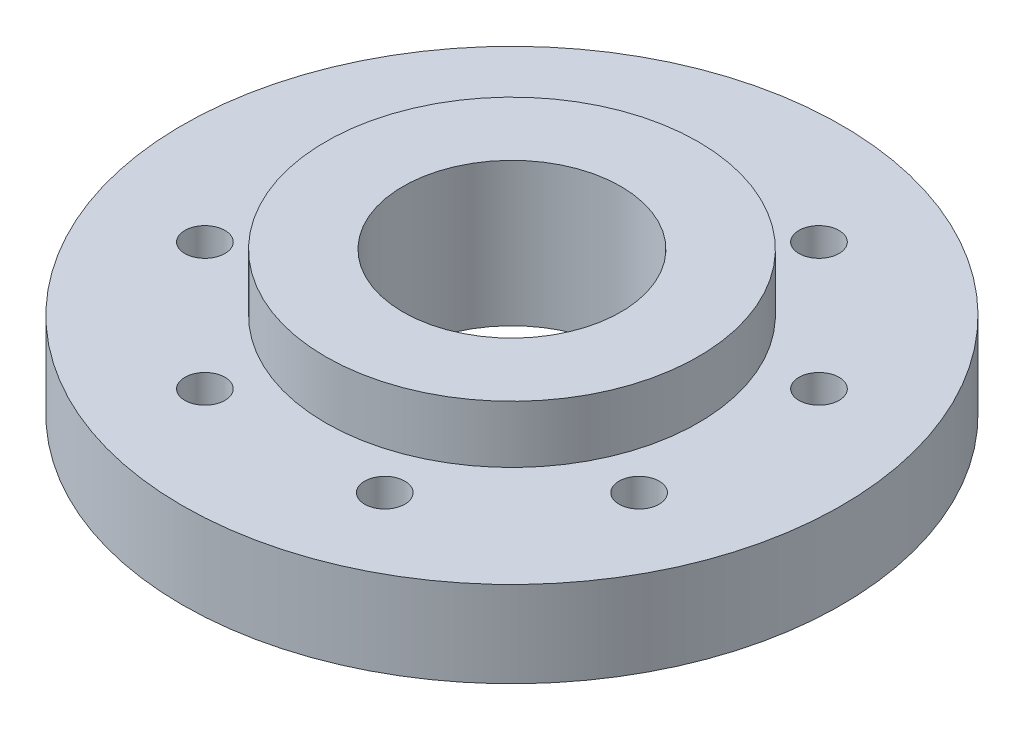
ISO-10303-21;
HEADER;
FILE_DESCRIPTION(('STEP AP214'),'2;1');
FILE_NAME('part.step','',(''),(''),'','','');
FILE_SCHEMA(('AUTOMOTIVE_DESIGN { 1 0 10303 214 1 1 1 1 }'));
ENDSEC;
DATA;
#1=APPLICATION_CONTEXT('core data for automotive mechanical design processes');
#2=APPLICATION_PROTOCOL_DEFINITION('international standard','automotive_design',2000,#1);
#3=PRODUCT_CONTEXT('',#1,'mechanical');
#4=PRODUCT('Part','Part','',(#3));
#5=PRODUCT_RELATED_PRODUCT_CATEGORY('part','',(#4));
#6=PRODUCT_DEFINITION_FORMATION('','',#4);
#7=PRODUCT_DEFINITION_CONTEXT('part definition',#1,'design');
#8=PRODUCT_DEFINITION('design','',#6,#7);
#9=PRODUCT_DEFINITION_SHAPE('','',#8);
#10=(LENGTH_UNIT() NAMED_UNIT(*) SI_UNIT(.MILLI.,.METRE.));
#11=(NAMED_UNIT(*) PLANE_ANGLE_UNIT() SI_UNIT($,.RADIAN.));
#12=(NAMED_UNIT(*) SI_UNIT($,.STERADIAN.) SOLID_ANGLE_UNIT());
#13=UNCERTAINTY_MEASURE_WITH_UNIT(LENGTH_MEASURE(1.E-05),#10,'distance_accuracy_value','');
#14=(GEOMETRIC_REPRESENTATION_CONTEXT(3) GLOBAL_UNCERTAINTY_ASSIGNED_CONTEXT((#13)) GLOBAL_UNIT_ASSIGNED_CONTEXT((#10,
#11,#12)) REPRESENTATION_CONTEXT('',''));
#15=CARTESIAN_POINT('',(0.,0.,0.));
#16=DIRECTION('',(0.,0.,1.));
#17=DIRECTION('',(1.,0.,0.));
#18=AXIS2_PLACEMENT_3D('',#15,#16,#17);
#19=CARTESIAN_POINT('',(0.,30.,0.));
#20=DIRECTION('',(0.,1.,0.));
#21=DIRECTION('',(0.,0.,1.));
#22=AXIS2_PLACEMENT_3D('',#19,#20,#21);
#23=PLANE('',#22);
#24=CARTESIAN_POINT('',(75.7581216659255,30.,31.3800414539374));
#25=DIRECTION('',(0.,1.,0.));
#26=DIRECTION('',(0.,0.,1.));
#27=AXIS2_PLACEMENT_3D('',#24,#25,#26);
#28=CIRCLE('',#27,7.);
#29=CARTESIAN_POINT('',(75.7581216659255,30.,38.3800414539374));
#30=VERTEX_POINT('',#29);
#31=EDGE_CURVE('E92',#30,#30,#28,.T.);
#32=ORIENTED_EDGE('',*,*,#31,.F.);
#33=EDGE_LOOP('',(#32));
#34=FACE_BOUND('',#33,.T.);
#35=CARTESIAN_POINT('',(-31.3800414539374,30.,75.7581216659255));
#36=DIRECTION('',(0.,1.,0.));
#37=DIRECTION('',(0.,0.,1.));
#38=AXIS2_PLACEMENT_3D('',#35,#36,#37);
#39=CIRCLE('',#38,7.00000000000002);
#40=CARTESIAN_POINT('',(-31.3800414539374,30.,82.7581216659255));
#41=VERTEX_POINT('',#40);
#42=EDGE_CURVE('E80',#41,#41,#39,.T.);
#43=ORIENTED_EDGE('',*,*,#42,.F.);
#44=EDGE_LOOP('',(#43));
#45=FACE_BOUND('',#44,.T.);
#46=CARTESIAN_POINT('',(-75.7581216659255,30.,-31.3800414539374));
#47=DIRECTION('',(0.,1.,0.));
#48=DIRECTION('',(0.,0.,1.));
#49=AXIS2_PLACEMENT_3D('',#46,#47,#48);
#50=CIRCLE('',#49,7.);
#51=CARTESIAN_POINT('',(-75.7581216659255,30.,-24.3800414539374));
#52=VERTEX_POINT('',#51);
#53=EDGE_CURVE('E68',#52,#52,#50,.T.);
#54=ORIENTED_EDGE('',*,*,#53,.F.);
#55=EDGE_LOOP('',(#54));
#56=FACE_BOUND('',#55,.T.);
#57=CARTESIAN_POINT('',(31.3800414539374,30.,-75.7581216659255));
#58=DIRECTION('',(0.,1.,0.));
#59=DIRECTION('',(0.,0.,1.));
#60=AXIS2_PLACEMENT_3D('',#57,#58,#59);
#61=CIRCLE('',#60,7.);
#62=CARTESIAN_POINT('',(31.3800414539374,30.,-68.7581216659255));
#63=VERTEX_POINT('',#62);
#64=EDGE_CURVE('E56',#63,#63,#61,.T.);
#65=ORIENTED_EDGE('',*,*,#64,.F.);
#66=EDGE_LOOP('',(#65));
#67=FACE_BOUND('',#66,.T.);
#68=CARTESIAN_POINT('',(0.,30.,0.));
#69=DIRECTION('',(0.,1.,0.));
#70=DIRECTION('',(0.,0.,1.));
#71=AXIS2_PLACEMENT_3D('',#68,#69,#70);
#72=CIRCLE('',#71,115.);
#73=CARTESIAN_POINT('',(0.,30.,115.));
#74=VERTEX_POINT('',#73);
#75=EDGE_CURVE('E10',#74,#74,#72,.T.);
#76=ORIENTED_EDGE('',*,*,#75,.T.);
#77=EDGE_LOOP('',(#76));
#78=FACE_BOUND('',#77,.T.);
#79=CARTESIAN_POINT('',(75.7581216659255,30.,-31.3800414539374));
#80=DIRECTION('',(0.,1.,0.));
#81=DIRECTION('',(0.,0.,1.));
#82=AXIS2_PLACEMENT_3D('',#79,#80,#81);
#83=CIRCLE('',#82,7.);
#84=CARTESIAN_POINT('',(75.7581216659255,30.,-24.3800414539374));
#85=VERTEX_POINT('',#84);
#86=EDGE_CURVE('E52',#85,#85,#83,.T.);
#87=ORIENTED_EDGE('',*,*,#86,.F.);
#88=EDGE_LOOP('',(#87));
#89=FACE_BOUND('',#88,.T.);
#90=CARTESIAN_POINT('',(-31.3800414539374,30.,-75.7581216659255));
#91=DIRECTION('',(0.,1.,0.));
#92=DIRECTION('',(0.,0.,1.));
#93=AXIS2_PLACEMENT_3D('',#90,#91,#92);
#94=CIRCLE('',#93,7.);
#95=CARTESIAN_POINT('',(-31.3800414539374,30.,-68.7581216659255));
#96=VERTEX_POINT('',#95);
#97=EDGE_CURVE('E62',#96,#96,#94,.T.);
#98=ORIENTED_EDGE('',*,*,#97,.F.);
#99=EDGE_LOOP('',(#98));
#100=FACE_BOUND('',#99,.T.);
#101=CARTESIAN_POINT('',(-75.7581216659255,30.,31.3800414539374));
#102=DIRECTION('',(0.,1.,0.));
#103=DIRECTION('',(0.,0.,1.));
#104=AXIS2_PLACEMENT_3D('',#101,#102,#103);
#105=CIRCLE('',#104,7.);
#106=CARTESIAN_POINT('',(-75.7581216659255,30.,38.3800414539374));
#107=VERTEX_POINT('',#106);
#108=EDGE_CURVE('E74',#107,#107,#105,.T.);
#109=ORIENTED_EDGE('',*,*,#108,.F.);
#110=EDGE_LOOP('',(#109));
#111=FACE_BOUND('',#110,.T.);
#112=CARTESIAN_POINT('',(31.3800414539374,30.,75.7581216659255));
#113=DIRECTION('',(0.,1.,0.));
#114=DIRECTION('',(0.,0.,1.));
#115=AXIS2_PLACEMENT_3D('',#112,#113,#114);
#116=CIRCLE('',#115,7.00000000000002);
#117=CARTESIAN_POINT('',(31.3800414539374,30.,82.7581216659255));
#118=VERTEX_POINT('',#117);
#119=EDGE_CURVE('E86',#118,#118,#116,.T.);
#120=ORIENTED_EDGE('',*,*,#119,.F.);
#121=EDGE_LOOP('',(#120));
#122=FACE_BOUND('',#121,.T.);
#123=CARTESIAN_POINT('',(0.,30.,0.));
#124=DIRECTION('',(0.,1.,0.));
#125=DIRECTION('',(0.,0.,1.));
#126=AXIS2_PLACEMENT_3D('',#123,#124,#125);
#127=CIRCLE('',#126,65.);
#128=CARTESIAN_POINT('',(0.,30.,65.));
#129=VERTEX_POINT('',#128);
#130=EDGE_CURVE('E98',#129,#129,#127,.F.);
#131=ORIENTED_EDGE('',*,*,#130,.T.);
#132=EDGE_LOOP('',(#131));
#133=FACE_BOUND('',#132,.T.);
#134=ADVANCED_FACE('F37',(#34,#45,#56,#67,#78,#89,#100,#111,#122,#133),#23,.T.);
#135=CARTESIAN_POINT('',(0.,0.,0.));
#136=DIRECTION('',(0.,1.,0.));
#137=DIRECTION('',(0.,0.,1.));
#138=AXIS2_PLACEMENT_3D('',#135,#136,#137);
#139=PLANE('',#138);
#140=CARTESIAN_POINT('',(0.,0.,0.));
#141=DIRECTION('',(0.,1.,0.));
#142=DIRECTION('',(0.,0.,1.));
#143=AXIS2_PLACEMENT_3D('',#140,#141,#142);
#144=CIRCLE('',#143,38.);
#145=CARTESIAN_POINT('',(0.,0.,38.));
#146=VERTEX_POINT('',#145);
#147=EDGE_CURVE('E48',#146,#146,#144,.T.);
#148=ORIENTED_EDGE('',*,*,#147,.T.);
#149=EDGE_LOOP('',(#148));
#150=FACE_BOUND('',#149,.T.);
#151=CARTESIAN_POINT('',(75.7581216659255,0.,31.3800414539374));
#152=DIRECTION('',(0.,1.,0.));
#153=DIRECTION('',(0.,0.,1.));
#154=AXIS2_PLACEMENT_3D('',#151,#152,#153);
#155=CIRCLE('',#154,7.);
#156=CARTESIAN_POINT('',(75.7581216659255,0.,38.3800414539374));
#157=VERTEX_POINT('',#156);
#158=EDGE_CURVE('E95',#157,#157,#155,.T.);
#159=ORIENTED_EDGE('',*,*,#158,.T.);
#160=EDGE_LOOP('',(#159));
#161=FACE_BOUND('',#160,.T.);
#162=CARTESIAN_POINT('',(31.3800414539374,0.,75.7581216659255));
#163=DIRECTION('',(0.,1.,0.));
#164=DIRECTION('',(0.,0.,1.));
#165=AXIS2_PLACEMENT_3D('',#162,#163,#164);
#166=CIRCLE('',#165,7.00000000000002);
#167=CARTESIAN_POINT('',(31.3800414539374,0.,82.7581216659255));
#168=VERTEX_POINT('',#167);
#169=EDGE_CURVE('E89',#168,#168,#166,.T.);
#170=ORIENTED_EDGE('',*,*,#169,.T.);
#171=EDGE_LOOP('',(#170));
#172=FACE_BOUND('',#171,.T.);
#173=CARTESIAN_POINT('',(-31.3800414539374,0.,75.7581216659255));
#174=DIRECTION('',(0.,1.,0.));
#175=DIRECTION('',(0.,0.,1.));
#176=AXIS2_PLACEMENT_3D('',#173,#174,#175);
#177=CIRCLE('',#176,7.00000000000002);
#178=CARTESIAN_POINT('',(-31.3800414539374,0.,82.7581216659255));
#179=VERTEX_POINT('',#178);
#180=EDGE_CURVE('E83',#179,#179,#177,.T.);
#181=ORIENTED_EDGE('',*,*,#180,.T.);
#182=EDGE_LOOP('',(#181));
#183=FACE_BOUND('',#182,.T.);
#184=CARTESIAN_POINT('',(-75.7581216659255,0.,31.3800414539374));
#185=DIRECTION('',(0.,1.,0.));
#186=DIRECTION('',(0.,0.,1.));
#187=AXIS2_PLACEMENT_3D('',#184,#185,#186);
#188=CIRCLE('',#187,7.);
#189=CARTESIAN_POINT('',(-75.7581216659255,0.,38.3800414539374));
#190=VERTEX_POINT('',#189);
#191=EDGE_CURVE('E77',#190,#190,#188,.T.);
#192=ORIENTED_EDGE('',*,*,#191,.T.);
#193=EDGE_LOOP('',(#192));
#194=FACE_BOUND('',#193,.T.);
#195=CARTESIAN_POINT('',(-75.7581216659255,0.,-31.3800414539374));
#196=DIRECTION('',(0.,1.,0.));
#197=DIRECTION('',(0.,0.,1.));
#198=AXIS2_PLACEMENT_3D('',#195,#196,#197);
#199=CIRCLE('',#198,7.);
#200=CARTESIAN_POINT('',(-75.7581216659255,0.,-24.3800414539374));
#201=VERTEX_POINT('',#200);
#202=EDGE_CURVE('E71',#201,#201,#199,.T.);
#203=ORIENTED_EDGE('',*,*,#202,.T.);
#204=EDGE_LOOP('',(#203));
#205=FACE_BOUND('',#204,.T.);
#206=CARTESIAN_POINT('',(-31.3800414539374,0.,-75.7581216659255));
#207=DIRECTION('',(0.,1.,0.));
#208=DIRECTION('',(0.,0.,1.));
#209=AXIS2_PLACEMENT_3D('',#206,#207,#208);
#210=CIRCLE('',#209,7.);
#211=CARTESIAN_POINT('',(-31.3800414539374,0.,-68.7581216659255));
#212=VERTEX_POINT('',#211);
#213=EDGE_CURVE('E65',#212,#212,#210,.T.);
#214=ORIENTED_EDGE('',*,*,#213,.T.);
#215=EDGE_LOOP('',(#214));
#216=FACE_BOUND('',#215,.T.);
#217=CARTESIAN_POINT('',(31.3800414539374,0.,-75.7581216659255));
#218=DIRECTION('',(0.,1.,0.));
#219=DIRECTION('',(0.,0.,1.));
#220=AXIS2_PLACEMENT_3D('',#217,#218,#219);
#221=CIRCLE('',#220,7.);
#222=CARTESIAN_POINT('',(31.3800414539374,0.,-68.7581216659255));
#223=VERTEX_POINT('',#222);
#224=EDGE_CURVE('E59',#223,#223,#221,.T.);
#225=ORIENTED_EDGE('',*,*,#224,.T.);
#226=EDGE_LOOP('',(#225));
#227=FACE_BOUND('',#226,.T.);
#228=CARTESIAN_POINT('',(75.7581216659255,0.,-31.3800414539374));
#229=DIRECTION('',(0.,1.,0.));
#230=DIRECTION('',(0.,0.,1.));
#231=AXIS2_PLACEMENT_3D('',#228,#229,#230);
#232=CIRCLE('',#231,7.);
#233=CARTESIAN_POINT('',(75.7581216659255,0.,-24.3800414539374));
#234=VERTEX_POINT('',#233);
#235=EDGE_CURVE('E53',#234,#234,#232,.T.);
#236=ORIENTED_EDGE('',*,*,#235,.T.);
#237=EDGE_LOOP('',(#236));
#238=FACE_BOUND('',#237,.T.);
#239=CARTESIAN_POINT('',(0.,0.,0.));
#240=DIRECTION('',(0.,1.,0.));
#241=DIRECTION('',(0.,0.,1.));
#242=AXIS2_PLACEMENT_3D('',#239,#240,#241);
#243=CIRCLE('',#242,115.);
#244=CARTESIAN_POINT('',(0.,0.,115.));
#245=VERTEX_POINT('',#244);
#246=EDGE_CURVE('E41',#245,#245,#243,.T.);
#247=ORIENTED_EDGE('',*,*,#246,.F.);
#248=EDGE_LOOP('',(#247));
#249=FACE_BOUND('',#248,.T.);
#250=ADVANCED_FACE('F128',(#150,#161,#172,#183,#194,#205,#216,#227,#238,#249),#139,.F.);
#251=CARTESIAN_POINT('',(0.,30.,0.));
#252=DIRECTION('',(0.,-1.,0.));
#253=DIRECTION('',(0.,0.,-1.));
#254=AXIS2_PLACEMENT_3D('',#251,#252,#253);
#255=CYLINDRICAL_SURFACE('',#254,115.);
#256=ORIENTED_EDGE('',*,*,#75,.F.);
#257=EDGE_LOOP('',(#256));
#258=FACE_BOUND('',#257,.T.);
#259=ORIENTED_EDGE('',*,*,#246,.T.);
#260=EDGE_LOOP('',(#259));
#261=FACE_BOUND('',#260,.T.);
#262=ADVANCED_FACE('F39',(#258,#261),#255,.T.);
#263=CARTESIAN_POINT('',(0.,30.,0.));
#264=DIRECTION('',(0.,-1.,0.));
#265=DIRECTION('',(0.,0.,-1.));
#266=AXIS2_PLACEMENT_3D('',#263,#264,#265);
#267=CYLINDRICAL_SURFACE('',#266,38.);
#268=ORIENTED_EDGE('',*,*,#147,.F.);
#269=EDGE_LOOP('',(#268));
#270=FACE_BOUND('',#269,.T.);
#271=CARTESIAN_POINT('',(0.,50.,0.));
#272=DIRECTION('',(0.,1.,0.));
#273=DIRECTION('',(0.,0.,1.));
#274=AXIS2_PLACEMENT_3D('',#271,#272,#273);
#275=CIRCLE('',#274,38.);
#276=CARTESIAN_POINT('',(0.,50.,38.));
#277=VERTEX_POINT('',#276);
#278=EDGE_CURVE('E106',#277,#277,#275,.T.);
#279=ORIENTED_EDGE('',*,*,#278,.T.);
#280=EDGE_LOOP('',(#279));
#281=FACE_BOUND('',#280,.T.);
#282=ADVANCED_FACE('F110',(#270,#281),#267,.F.);
#283=CARTESIAN_POINT('',(75.7581216659255,30.,-31.3800414539374));
#284=DIRECTION('',(0.,-1.,0.));
#285=DIRECTION('',(0.,0.,-1.));
#286=AXIS2_PLACEMENT_3D('',#283,#284,#285);
#287=CYLINDRICAL_SURFACE('',#286,7.);
#288=ORIENTED_EDGE('',*,*,#86,.T.);
#289=EDGE_LOOP('',(#288));
#290=FACE_BOUND('',#289,.T.);
#291=ORIENTED_EDGE('',*,*,#235,.F.);
#292=EDGE_LOOP('',(#291));
#293=FACE_BOUND('',#292,.T.);
#294=ADVANCED_FACE('F140',(#290,#293),#287,.F.);
#295=CARTESIAN_POINT('',(31.3800414539374,30.,-75.7581216659255));
#296=DIRECTION('',(0.,-1.,0.));
#297=DIRECTION('',(0.,0.,-1.));
#298=AXIS2_PLACEMENT_3D('',#295,#296,#297);
#299=CYLINDRICAL_SURFACE('',#298,7.);
#300=ORIENTED_EDGE('',*,*,#64,.T.);
#301=EDGE_LOOP('',(#300));
#302=FACE_BOUND('',#301,.T.);
#303=ORIENTED_EDGE('',*,*,#224,.F.);
#304=EDGE_LOOP('',(#303));
#305=FACE_BOUND('',#304,.T.);
#306=ADVANCED_FACE('F144',(#302,#305),#299,.F.);
#307=CARTESIAN_POINT('',(-31.3800414539374,30.,-75.7581216659255));
#308=DIRECTION('',(0.,-1.,0.));
#309=DIRECTION('',(0.,0.,-1.));
#310=AXIS2_PLACEMENT_3D('',#307,#308,#309);
#311=CYLINDRICAL_SURFACE('',#310,7.);
#312=ORIENTED_EDGE('',*,*,#97,.T.);
#313=EDGE_LOOP('',(#312));
#314=FACE_BOUND('',#313,.T.);
#315=ORIENTED_EDGE('',*,*,#213,.F.);
#316=EDGE_LOOP('',(#315));
#317=FACE_BOUND('',#316,.T.);
#318=ADVANCED_FACE('F148',(#314,#317),#311,.F.);
#319=CARTESIAN_POINT('',(-75.7581216659255,30.,-31.3800414539374));
#320=DIRECTION('',(0.,-1.,0.));
#321=DIRECTION('',(0.,0.,-1.));
#322=AXIS2_PLACEMENT_3D('',#319,#320,#321);
#323=CYLINDRICAL_SURFACE('',#322,7.);
#324=ORIENTED_EDGE('',*,*,#53,.T.);
#325=EDGE_LOOP('',(#324));
#326=FACE_BOUND('',#325,.T.);
#327=ORIENTED_EDGE('',*,*,#202,.F.);
#328=EDGE_LOOP('',(#327));
#329=FACE_BOUND('',#328,.T.);
#330=ADVANCED_FACE('F152',(#326,#329),#323,.F.);
#331=CARTESIAN_POINT('',(-75.7581216659255,30.,31.3800414539374));
#332=DIRECTION('',(0.,-1.,0.));
#333=DIRECTION('',(0.,0.,-1.));
#334=AXIS2_PLACEMENT_3D('',#331,#332,#333);
#335=CYLINDRICAL_SURFACE('',#334,7.);
#336=ORIENTED_EDGE('',*,*,#108,.T.);
#337=EDGE_LOOP('',(#336));
#338=FACE_BOUND('',#337,.T.);
#339=ORIENTED_EDGE('',*,*,#191,.F.);
#340=EDGE_LOOP('',(#339));
#341=FACE_BOUND('',#340,.T.);
#342=ADVANCED_FACE('F156',(#338,#341),#335,.F.);
#343=CARTESIAN_POINT('',(-31.3800414539374,30.,75.7581216659255));
#344=DIRECTION('',(0.,-1.,0.));
#345=DIRECTION('',(0.,0.,-1.));
#346=AXIS2_PLACEMENT_3D('',#343,#344,#345);
#347=CYLINDRICAL_SURFACE('',#346,7.00000000000002);
#348=ORIENTED_EDGE('',*,*,#42,.T.);
#349=EDGE_LOOP('',(#348));
#350=FACE_BOUND('',#349,.T.);
#351=ORIENTED_EDGE('',*,*,#180,.F.);
#352=EDGE_LOOP('',(#351));
#353=FACE_BOUND('',#352,.T.);
#354=ADVANCED_FACE('F160',(#350,#353),#347,.F.);
#355=CARTESIAN_POINT('',(31.3800414539374,30.,75.7581216659255));
#356=DIRECTION('',(0.,-1.,0.));
#357=DIRECTION('',(0.,0.,-1.));
#358=AXIS2_PLACEMENT_3D('',#355,#356,#357);
#359=CYLINDRICAL_SURFACE('',#358,7.00000000000002);
#360=ORIENTED_EDGE('',*,*,#119,.T.);
#361=EDGE_LOOP('',(#360));
#362=FACE_BOUND('',#361,.T.);
#363=ORIENTED_EDGE('',*,*,#169,.F.);
#364=EDGE_LOOP('',(#363));
#365=FACE_BOUND('',#364,.T.);
#366=ADVANCED_FACE('F124',(#362,#365),#359,.F.);
#367=CARTESIAN_POINT('',(75.7581216659255,30.,31.3800414539374));
#368=DIRECTION('',(0.,-1.,0.));
#369=DIRECTION('',(0.,0.,-1.));
#370=AXIS2_PLACEMENT_3D('',#367,#368,#369);
#371=CYLINDRICAL_SURFACE('',#370,7.);
#372=ORIENTED_EDGE('',*,*,#31,.T.);
#373=EDGE_LOOP('',(#372));
#374=FACE_BOUND('',#373,.T.);
#375=ORIENTED_EDGE('',*,*,#158,.F.);
#376=EDGE_LOOP('',(#375));
#377=FACE_BOUND('',#376,.T.);
#378=ADVANCED_FACE('F115',(#374,#377),#371,.F.);
#379=CARTESIAN_POINT('',(0.,50.,0.));
#380=DIRECTION('',(0.,1.,0.));
#381=DIRECTION('',(0.,0.,1.));
#382=AXIS2_PLACEMENT_3D('',#379,#380,#381);
#383=PLANE('',#382);
#384=CARTESIAN_POINT('',(0.,50.,0.));
#385=DIRECTION('',(0.,1.,0.));
#386=DIRECTION('',(0.,0.,1.));
#387=AXIS2_PLACEMENT_3D('',#384,#385,#386);
#388=CIRCLE('',#387,65.);
#389=CARTESIAN_POINT('',(0.,50.,65.));
#390=VERTEX_POINT('',#389);
#391=EDGE_CURVE('E103',#390,#390,#388,.T.);
#392=ORIENTED_EDGE('',*,*,#391,.T.);
#393=EDGE_LOOP('',(#392));
#394=FACE_BOUND('',#393,.T.);
#395=ORIENTED_EDGE('',*,*,#278,.F.);
#396=EDGE_LOOP('',(#395));
#397=FACE_BOUND('',#396,.T.);
#398=ADVANCED_FACE('F112',(#394,#397),#383,.T.);
#399=CARTESIAN_POINT('',(0.,50.,0.));
#400=DIRECTION('',(0.,-1.,0.));
#401=DIRECTION('',(0.,0.,-1.));
#402=AXIS2_PLACEMENT_3D('',#399,#400,#401);
#403=CYLINDRICAL_SURFACE('',#402,65.);
#404=ORIENTED_EDGE('',*,*,#130,.F.);
#405=EDGE_LOOP('',(#404));
#406=FACE_BOUND('',#405,.T.);
#407=ORIENTED_EDGE('',*,*,#391,.F.);
#408=EDGE_LOOP('',(#407));
#409=FACE_BOUND('',#408,.T.);
#410=ADVANCED_FACE('F114',(#406,#409),#403,.T.);
#411=CLOSED_SHELL('',(#134,#250,#262,#282,#294,#306,#318,#330,#342,#354,#366,#378,#398,#410));
#412=MANIFOLD_SOLID_BREP('B2',#411);
#413=ADVANCED_BREP_SHAPE_REPRESENTATION('',(#18,#412),#14);
#414=SHAPE_DEFINITION_REPRESENTATION(#9,#413);
ENDSEC;
END-ISO-10303-21;
